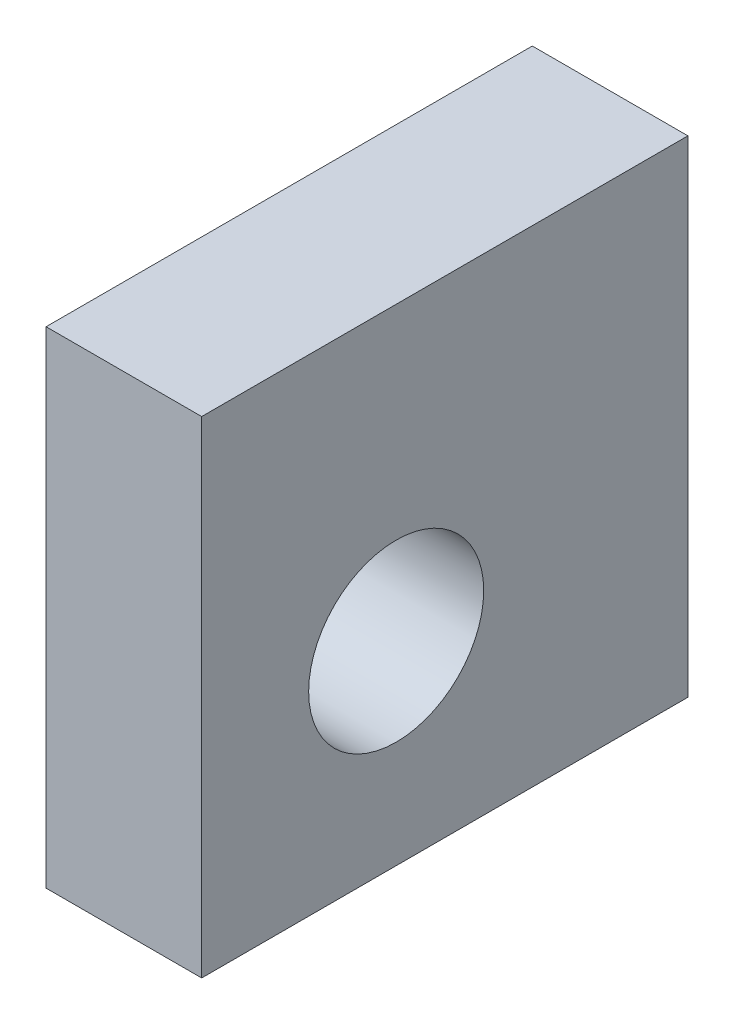
ISO-10303-21;
HEADER;
FILE_DESCRIPTION(('STEP AP214'),'2;1');
FILE_NAME('part.step','',(''),(''),'','','');
FILE_SCHEMA(('AUTOMOTIVE_DESIGN { 1 0 10303 214 1 1 1 1 }'));
ENDSEC;
DATA;
#1=APPLICATION_CONTEXT('core data for automotive mechanical design processes');
#2=APPLICATION_PROTOCOL_DEFINITION('international standard','automotive_design',2000,#1);
#3=PRODUCT_CONTEXT('',#1,'mechanical');
#4=PRODUCT('Part','Part','',(#3));
#5=PRODUCT_RELATED_PRODUCT_CATEGORY('part','',(#4));
#6=PRODUCT_DEFINITION_FORMATION('','',#4);
#7=PRODUCT_DEFINITION_CONTEXT('part definition',#1,'design');
#8=PRODUCT_DEFINITION('design','',#6,#7);
#9=PRODUCT_DEFINITION_SHAPE('','',#8);
#10=(LENGTH_UNIT() NAMED_UNIT(*) SI_UNIT(.MILLI.,.METRE.));
#11=(NAMED_UNIT(*) PLANE_ANGLE_UNIT() SI_UNIT($,.RADIAN.));
#12=(NAMED_UNIT(*) SI_UNIT($,.STERADIAN.) SOLID_ANGLE_UNIT());
#13=UNCERTAINTY_MEASURE_WITH_UNIT(LENGTH_MEASURE(1.E-05),#10,'distance_accuracy_value','');
#14=(GEOMETRIC_REPRESENTATION_CONTEXT(3) GLOBAL_UNCERTAINTY_ASSIGNED_CONTEXT((#13)) GLOBAL_UNIT_ASSIGNED_CONTEXT((#10,
#11,#12)) REPRESENTATION_CONTEXT('',''));
#15=CARTESIAN_POINT('',(0.,0.,0.));
#16=DIRECTION('',(0.,0.,1.));
#17=DIRECTION('',(1.,0.,0.));
#18=AXIS2_PLACEMENT_3D('',#15,#16,#17);
#19=CARTESIAN_POINT('',(8.,0.,0.));
#20=DIRECTION('',(-1.,0.,0.));
#21=DIRECTION('',(0.,0.,1.));
#22=AXIS2_PLACEMENT_3D('',#19,#20,#21);
#23=PLANE('',#22);
#24=DIRECTION('',(0.,1.,0.));
#25=VECTOR('',#24,1.);
#26=CARTESIAN_POINT('',(8.,-12.5,-12.5));
#27=LINE('',#26,#25);
#28=CARTESIAN_POINT('',(8.,-12.5,-12.5));
#29=VERTEX_POINT('',#28);
#30=CARTESIAN_POINT('',(8.,12.5,-12.5));
#31=VERTEX_POINT('',#30);
#32=EDGE_CURVE('E85',#29,#31,#27,.T.);
#33=ORIENTED_EDGE('',*,*,#32,.T.);
#34=DIRECTION('',(0.,0.,1.));
#35=VECTOR('',#34,1.);
#36=CARTESIAN_POINT('',(8.,12.5,12.5));
#37=LINE('',#36,#35);
#38=CARTESIAN_POINT('',(8.,12.5,12.5));
#39=VERTEX_POINT('',#38);
#40=EDGE_CURVE('E80',#31,#39,#37,.T.);
#41=ORIENTED_EDGE('',*,*,#40,.T.);
#42=DIRECTION('',(0.,-1.,0.));
#43=VECTOR('',#42,1.);
#44=CARTESIAN_POINT('',(8.,-12.5,12.5));
#45=LINE('',#44,#43);
#46=CARTESIAN_POINT('',(8.,-12.5,12.5));
#47=VERTEX_POINT('',#46);
#48=EDGE_CURVE('E83',#39,#47,#45,.T.);
#49=ORIENTED_EDGE('',*,*,#48,.T.);
#50=DIRECTION('',(0.,0.,-1.));
#51=VECTOR('',#50,1.);
#52=CARTESIAN_POINT('',(8.,-12.5,12.5));
#53=LINE('',#52,#51);
#54=EDGE_CURVE('E50',#47,#29,#53,.T.);
#55=ORIENTED_EDGE('',*,*,#54,.T.);
#56=EDGE_LOOP('',(#33,#41,#49,#55));
#57=FACE_BOUND('',#56,.T.);
#58=CARTESIAN_POINT('',(8.,-2.5,2.5));
#59=DIRECTION('',(1.,0.,0.));
#60=DIRECTION('',(0.,0.,-1.));
#61=AXIS2_PLACEMENT_3D('',#58,#59,#60);
#62=CIRCLE('',#61,4.5);
#63=CARTESIAN_POINT('',(8.,-2.5,-2.));
#64=VERTEX_POINT('',#63);
#65=EDGE_CURVE('E100',#64,#64,#62,.T.);
#66=ORIENTED_EDGE('',*,*,#65,.F.);
#67=EDGE_LOOP('',(#66));
#68=FACE_BOUND('',#67,.T.);
#69=ADVANCED_FACE('F33',(#57,#68),#23,.F.);
#70=CARTESIAN_POINT('',(0.,0.,0.));
#71=DIRECTION('',(-1.,0.,0.));
#72=DIRECTION('',(0.,0.,1.));
#73=AXIS2_PLACEMENT_3D('',#70,#71,#72);
#74=PLANE('',#73);
#75=DIRECTION('',(0.,1.,0.));
#76=VECTOR('',#75,1.);
#77=CARTESIAN_POINT('',(0.,-12.5,-12.5));
#78=LINE('',#77,#76);
#79=CARTESIAN_POINT('',(0.,-12.5,-12.5));
#80=VERTEX_POINT('',#79);
#81=CARTESIAN_POINT('',(0.,12.5,-12.5));
#82=VERTEX_POINT('',#81);
#83=EDGE_CURVE('E97',#80,#82,#78,.T.);
#84=ORIENTED_EDGE('',*,*,#83,.F.);
#85=DIRECTION('',(0.,0.,-1.));
#86=VECTOR('',#85,1.);
#87=CARTESIAN_POINT('',(0.,-12.5,12.5));
#88=LINE('',#87,#86);
#89=CARTESIAN_POINT('',(0.,-12.5,12.5));
#90=VERTEX_POINT('',#89);
#91=EDGE_CURVE('E73',#90,#80,#88,.T.);
#92=ORIENTED_EDGE('',*,*,#91,.F.);
#93=DIRECTION('',(0.,-1.,0.));
#94=VECTOR('',#93,1.);
#95=CARTESIAN_POINT('',(0.,-12.5,12.5));
#96=LINE('',#95,#94);
#97=CARTESIAN_POINT('',(0.,12.5,12.5));
#98=VERTEX_POINT('',#97);
#99=EDGE_CURVE('E67',#98,#90,#96,.T.);
#100=ORIENTED_EDGE('',*,*,#99,.F.);
#101=DIRECTION('',(0.,0.,1.));
#102=VECTOR('',#101,1.);
#103=CARTESIAN_POINT('',(0.,12.5,12.5));
#104=LINE('',#103,#102);
#105=EDGE_CURVE('E89',#82,#98,#104,.T.);
#106=ORIENTED_EDGE('',*,*,#105,.F.);
#107=EDGE_LOOP('',(#84,#92,#100,#106));
#108=FACE_BOUND('',#107,.T.);
#109=CARTESIAN_POINT('',(0.,-2.5,2.5));
#110=DIRECTION('',(1.,0.,0.));
#111=DIRECTION('',(0.,0.,-1.));
#112=AXIS2_PLACEMENT_3D('',#109,#110,#111);
#113=CIRCLE('',#112,4.5);
#114=CARTESIAN_POINT('',(0.,-2.5,-2.));
#115=VERTEX_POINT('',#114);
#116=EDGE_CURVE('E112',#115,#115,#113,.T.);
#117=ORIENTED_EDGE('',*,*,#116,.T.);
#118=EDGE_LOOP('',(#117));
#119=FACE_BOUND('',#118,.T.);
#120=ADVANCED_FACE('F108',(#108,#119),#74,.T.);
#121=CARTESIAN_POINT('',(8.,-12.5,-12.5));
#122=DIRECTION('',(0.,0.,1.));
#123=DIRECTION('',(1.,0.,0.));
#124=AXIS2_PLACEMENT_3D('',#121,#122,#123);
#125=PLANE('',#124);
#126=ORIENTED_EDGE('',*,*,#83,.T.);
#127=DIRECTION('',(-1.,0.,0.));
#128=VECTOR('',#127,1.);
#129=CARTESIAN_POINT('',(8.,12.5,-12.5));
#130=LINE('',#129,#128);
#131=EDGE_CURVE('E11',#31,#82,#130,.T.);
#132=ORIENTED_EDGE('',*,*,#131,.F.);
#133=ORIENTED_EDGE('',*,*,#32,.F.);
#134=DIRECTION('',(-1.,0.,0.));
#135=VECTOR('',#134,1.);
#136=CARTESIAN_POINT('',(8.,-12.5,-12.5));
#137=LINE('',#136,#135);
#138=EDGE_CURVE('E93',#29,#80,#137,.T.);
#139=ORIENTED_EDGE('',*,*,#138,.T.);
#140=EDGE_LOOP('',(#126,#132,#133,#139));
#141=FACE_BOUND('',#140,.T.);
#142=ADVANCED_FACE('F35',(#141),#125,.F.);
#143=CARTESIAN_POINT('',(8.,12.5,12.5));
#144=DIRECTION('',(0.,-1.,0.));
#145=DIRECTION('',(0.,0.,-1.));
#146=AXIS2_PLACEMENT_3D('',#143,#144,#145);
#147=PLANE('',#146);
#148=ORIENTED_EDGE('',*,*,#105,.T.);
#149=DIRECTION('',(-1.,0.,0.));
#150=VECTOR('',#149,1.);
#151=CARTESIAN_POINT('',(8.,12.5,12.5));
#152=LINE('',#151,#150);
#153=EDGE_CURVE('E42',#39,#98,#152,.T.);
#154=ORIENTED_EDGE('',*,*,#153,.F.);
#155=ORIENTED_EDGE('',*,*,#40,.F.);
#156=ORIENTED_EDGE('',*,*,#131,.T.);
#157=EDGE_LOOP('',(#148,#154,#155,#156));
#158=FACE_BOUND('',#157,.T.);
#159=ADVANCED_FACE('F88',(#158),#147,.F.);
#160=CARTESIAN_POINT('',(8.,-12.5,12.5));
#161=DIRECTION('',(0.,0.,-1.));
#162=DIRECTION('',(-1.,0.,0.));
#163=AXIS2_PLACEMENT_3D('',#160,#161,#162);
#164=PLANE('',#163);
#165=ORIENTED_EDGE('',*,*,#99,.T.);
#166=DIRECTION('',(-1.,0.,0.));
#167=VECTOR('',#166,1.);
#168=CARTESIAN_POINT('',(8.,-12.5,12.5));
#169=LINE('',#168,#167);
#170=EDGE_CURVE('E90',#47,#90,#169,.T.);
#171=ORIENTED_EDGE('',*,*,#170,.F.);
#172=ORIENTED_EDGE('',*,*,#48,.F.);
#173=ORIENTED_EDGE('',*,*,#153,.T.);
#174=EDGE_LOOP('',(#165,#171,#172,#173));
#175=FACE_BOUND('',#174,.T.);
#176=ADVANCED_FACE('F91',(#175),#164,.F.);
#177=CARTESIAN_POINT('',(8.,-12.5,12.5));
#178=DIRECTION('',(0.,1.,0.));
#179=DIRECTION('',(0.,0.,1.));
#180=AXIS2_PLACEMENT_3D('',#177,#178,#179);
#181=PLANE('',#180);
#182=ORIENTED_EDGE('',*,*,#91,.T.);
#183=ORIENTED_EDGE('',*,*,#138,.F.);
#184=ORIENTED_EDGE('',*,*,#54,.F.);
#185=ORIENTED_EDGE('',*,*,#170,.T.);
#186=EDGE_LOOP('',(#182,#183,#184,#185));
#187=FACE_BOUND('',#186,.T.);
#188=ADVANCED_FACE('F105',(#187),#181,.F.);
#189=CARTESIAN_POINT('',(8.,-2.5,2.5));
#190=DIRECTION('',(-1.,0.,0.));
#191=DIRECTION('',(0.,0.,1.));
#192=AXIS2_PLACEMENT_3D('',#189,#190,#191);
#193=CYLINDRICAL_SURFACE('',#192,4.5);
#194=ORIENTED_EDGE('',*,*,#65,.T.);
#195=EDGE_LOOP('',(#194));
#196=FACE_BOUND('',#195,.T.);
#197=ORIENTED_EDGE('',*,*,#116,.F.);
#198=EDGE_LOOP('',(#197));
#199=FACE_BOUND('',#198,.T.);
#200=ADVANCED_FACE('F118',(#196,#199),#193,.F.);
#201=CLOSED_SHELL('',(#69,#120,#142,#159,#176,#188,#200));
#202=MANIFOLD_SOLID_BREP('B2',#201);
#203=ADVANCED_BREP_SHAPE_REPRESENTATION('',(#18,#202),#14);
#204=SHAPE_DEFINITION_REPRESENTATION(#9,#203);
ENDSEC;
END-ISO-10303-21;
